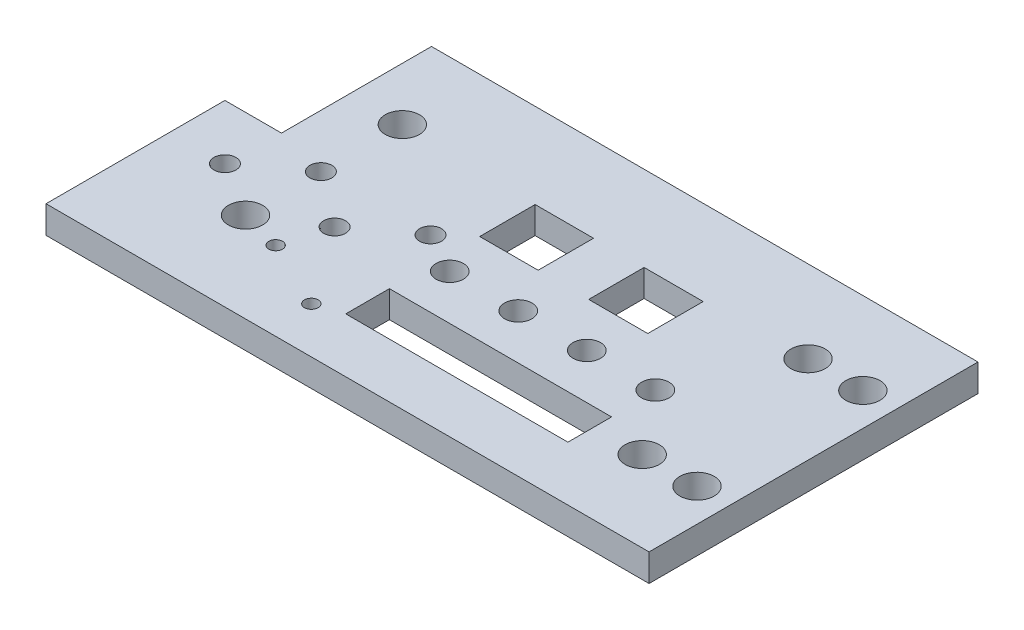
ISO-10303-21;
HEADER;
FILE_DESCRIPTION(('STEP AP214'),'2;1');
FILE_NAME('part.step','',(''),(''),'','','');
FILE_SCHEMA(('AUTOMOTIVE_DESIGN { 1 0 10303 214 1 1 1 1 }'));
ENDSEC;
DATA;
#1=APPLICATION_CONTEXT('core data for automotive mechanical design processes');
#2=APPLICATION_PROTOCOL_DEFINITION('international standard','automotive_design',2000,#1);
#3=PRODUCT_CONTEXT('',#1,'mechanical');
#4=PRODUCT('Part','Part','',(#3));
#5=PRODUCT_RELATED_PRODUCT_CATEGORY('part','',(#4));
#6=PRODUCT_DEFINITION_FORMATION('','',#4);
#7=PRODUCT_DEFINITION_CONTEXT('part definition',#1,'design');
#8=PRODUCT_DEFINITION('design','',#6,#7);
#9=PRODUCT_DEFINITION_SHAPE('','',#8);
#10=(LENGTH_UNIT() NAMED_UNIT(*) SI_UNIT(.MILLI.,.METRE.));
#11=(NAMED_UNIT(*) PLANE_ANGLE_UNIT() SI_UNIT($,.RADIAN.));
#12=(NAMED_UNIT(*) SI_UNIT($,.STERADIAN.) SOLID_ANGLE_UNIT());
#13=UNCERTAINTY_MEASURE_WITH_UNIT(LENGTH_MEASURE(1.E-05),#10,'distance_accuracy_value','');
#14=(GEOMETRIC_REPRESENTATION_CONTEXT(3) GLOBAL_UNCERTAINTY_ASSIGNED_CONTEXT((#13)) GLOBAL_UNIT_ASSIGNED_CONTEXT((#10,
#11,#12)) REPRESENTATION_CONTEXT('',''));
#15=CARTESIAN_POINT('',(0.,0.,0.));
#16=DIRECTION('',(0.,0.,1.));
#17=DIRECTION('',(1.,0.,0.));
#18=AXIS2_PLACEMENT_3D('',#15,#16,#17);
#19=CARTESIAN_POINT('',(110.,-10.,60.));
#20=DIRECTION('',(1.,0.,0.));
#21=DIRECTION('',(0.,0.,-1.));
#22=AXIS2_PLACEMENT_3D('',#19,#20,#21);
#23=PLANE('',#22);
#24=DIRECTION('',(0.,0.,-1.));
#25=VECTOR('',#24,1.);
#26=CARTESIAN_POINT('',(110.,0.,60.));
#27=LINE('',#26,#25);
#28=CARTESIAN_POINT('',(110.,0.,60.));
#29=VERTEX_POINT('',#28);
#30=CARTESIAN_POINT('',(110.,0.,-60.));
#31=VERTEX_POINT('',#30);
#32=EDGE_CURVE('E328',#29,#31,#27,.T.);
#33=ORIENTED_EDGE('',*,*,#32,.F.);
#34=DIRECTION('',(0.,1.,0.));
#35=VECTOR('',#34,1.);
#36=CARTESIAN_POINT('',(110.,-10.,60.));
#37=LINE('',#36,#35);
#38=CARTESIAN_POINT('',(110.,-10.,60.));
#39=VERTEX_POINT('',#38);
#40=EDGE_CURVE('E11',#39,#29,#37,.T.);
#41=ORIENTED_EDGE('',*,*,#40,.F.);
#42=DIRECTION('',(0.,0.,-1.));
#43=VECTOR('',#42,1.);
#44=CARTESIAN_POINT('',(110.,-10.,60.));
#45=LINE('',#44,#43);
#46=CARTESIAN_POINT('',(110.,-10.,-60.));
#47=VERTEX_POINT('',#46);
#48=EDGE_CURVE('E329',#39,#47,#45,.T.);
#49=ORIENTED_EDGE('',*,*,#48,.T.);
#50=DIRECTION('',(0.,1.,0.));
#51=VECTOR('',#50,1.);
#52=CARTESIAN_POINT('',(110.,-10.,-60.));
#53=LINE('',#52,#51);
#54=EDGE_CURVE('E341',#47,#31,#53,.T.);
#55=ORIENTED_EDGE('',*,*,#54,.T.);
#56=EDGE_LOOP('',(#33,#41,#49,#55));
#57=FACE_BOUND('',#56,.T.);
#58=ADVANCED_FACE('F41',(#57),#23,.T.);
#59=CARTESIAN_POINT('',(-110.,-10.,60.));
#60=DIRECTION('',(0.,0.,1.));
#61=DIRECTION('',(1.,0.,0.));
#62=AXIS2_PLACEMENT_3D('',#59,#60,#61);
#63=PLANE('',#62);
#64=DIRECTION('',(1.,0.,0.));
#65=VECTOR('',#64,1.);
#66=CARTESIAN_POINT('',(-110.,0.,60.));
#67=LINE('',#66,#65);
#68=CARTESIAN_POINT('',(-110.,0.,60.));
#69=VERTEX_POINT('',#68);
#70=EDGE_CURVE('E333',#69,#29,#67,.T.);
#71=ORIENTED_EDGE('',*,*,#70,.F.);
#72=DIRECTION('',(0.,1.,0.));
#73=VECTOR('',#72,1.);
#74=CARTESIAN_POINT('',(-110.,-10.,60.));
#75=LINE('',#74,#73);
#76=CARTESIAN_POINT('',(-110.,-10.,60.));
#77=VERTEX_POINT('',#76);
#78=EDGE_CURVE('E51',#77,#69,#75,.T.);
#79=ORIENTED_EDGE('',*,*,#78,.F.);
#80=DIRECTION('',(1.,0.,0.));
#81=VECTOR('',#80,1.);
#82=CARTESIAN_POINT('',(-110.,-10.,60.));
#83=LINE('',#82,#81);
#84=EDGE_CURVE('E338',#77,#39,#83,.T.);
#85=ORIENTED_EDGE('',*,*,#84,.T.);
#86=ORIENTED_EDGE('',*,*,#40,.T.);
#87=EDGE_LOOP('',(#71,#79,#85,#86));
#88=FACE_BOUND('',#87,.T.);
#89=ADVANCED_FACE('F423',(#88),#63,.T.);
#90=CARTESIAN_POINT('',(-110.,-10.,60.));
#91=DIRECTION('',(-1.,0.,0.));
#92=DIRECTION('',(0.,0.,1.));
#93=AXIS2_PLACEMENT_3D('',#90,#91,#92);
#94=PLANE('',#93);
#95=DIRECTION('',(0.,1.,0.));
#96=VECTOR('',#95,1.);
#97=CARTESIAN_POINT('',(-110.,-10.001,-5.2699959967968));
#98=LINE('',#97,#96);
#99=CARTESIAN_POINT('',(-110.,-10.,-5.2699959967968));
#100=VERTEX_POINT('',#99);
#101=CARTESIAN_POINT('',(-110.,0.,-5.2699959967968));
#102=VERTEX_POINT('',#101);
#103=EDGE_CURVE('E318',#100,#102,#98,.T.);
#104=ORIENTED_EDGE('',*,*,#103,.F.);
#105=DIRECTION('',(0.,0.,1.));
#106=VECTOR('',#105,1.);
#107=CARTESIAN_POINT('',(-110.,-10.,60.));
#108=LINE('',#107,#106);
#109=EDGE_CURVE('E336',#100,#77,#108,.T.);
#110=ORIENTED_EDGE('',*,*,#109,.T.);
#111=ORIENTED_EDGE('',*,*,#78,.T.);
#112=DIRECTION('',(0.,0.,1.));
#113=VECTOR('',#112,1.);
#114=CARTESIAN_POINT('',(-110.,0.,60.));
#115=LINE('',#114,#113);
#116=EDGE_CURVE('E347',#102,#69,#115,.T.);
#117=ORIENTED_EDGE('',*,*,#116,.F.);
#118=EDGE_LOOP('',(#104,#110,#111,#117));
#119=FACE_BOUND('',#118,.T.);
#120=ADVANCED_FACE('F429',(#119),#94,.T.);
#121=CARTESIAN_POINT('',(-110.,-10.,-60.));
#122=DIRECTION('',(0.,0.,-1.));
#123=DIRECTION('',(-1.,0.,0.));
#124=AXIS2_PLACEMENT_3D('',#121,#122,#123);
#125=PLANE('',#124);
#126=DIRECTION('',(0.,1.,0.));
#127=VECTOR('',#126,1.);
#128=CARTESIAN_POINT('',(-89.3674969975976,-10.001,-60.));
#129=LINE('',#128,#127);
#130=CARTESIAN_POINT('',(-89.3674969975976,-10.,-60.));
#131=VERTEX_POINT('',#130);
#132=CARTESIAN_POINT('',(-89.3674969975976,0.,-60.));
#133=VERTEX_POINT('',#132);
#134=EDGE_CURVE('E319',#131,#133,#129,.T.);
#135=ORIENTED_EDGE('',*,*,#134,.T.);
#136=DIRECTION('',(-1.,0.,0.));
#137=VECTOR('',#136,1.);
#138=CARTESIAN_POINT('',(-110.,0.,-60.));
#139=LINE('',#138,#137);
#140=EDGE_CURVE('E344',#31,#133,#139,.T.);
#141=ORIENTED_EDGE('',*,*,#140,.F.);
#142=ORIENTED_EDGE('',*,*,#54,.F.);
#143=DIRECTION('',(-1.,0.,0.));
#144=VECTOR('',#143,1.);
#145=CARTESIAN_POINT('',(-110.,-10.,-60.));
#146=LINE('',#145,#144);
#147=EDGE_CURVE('E332',#47,#131,#146,.T.);
#148=ORIENTED_EDGE('',*,*,#147,.T.);
#149=EDGE_LOOP('',(#135,#141,#142,#148));
#150=FACE_BOUND('',#149,.T.);
#151=ADVANCED_FACE('F435',(#150),#125,.T.);
#152=CARTESIAN_POINT('',(0.,-10.,0.));
#153=DIRECTION('',(0.,-1.,0.));
#154=DIRECTION('',(0.,0.,-1.));
#155=AXIS2_PLACEMENT_3D('',#152,#153,#154);
#156=PLANE('',#155);
#157=DIRECTION('',(1.,0.,0.));
#158=VECTOR('',#157,1.);
#159=CARTESIAN_POINT('',(0.,-10.,40.3023463893584));
#160=LINE('',#159,#158);
#161=CARTESIAN_POINT('',(60.7023463893584,-10.,40.3023463893584));
#162=VERTEX_POINT('',#161);
#163=CARTESIAN_POINT('',(-20.7023463893584,-10.,40.3023463893584));
#164=VERTEX_POINT('',#163);
#165=EDGE_CURVE('E60',#162,#164,#160,.F.);
#166=ORIENTED_EDGE('',*,*,#165,.F.);
#167=DIRECTION('',(0.,0.,-1.));
#168=VECTOR('',#167,1.);
#169=CARTESIAN_POINT('',(60.7023463893584,-10.,0.));
#170=LINE('',#169,#168);
#171=CARTESIAN_POINT('',(60.7023463893584,-10.,24.0176536106416));
#172=VERTEX_POINT('',#171);
#173=EDGE_CURVE('E358',#172,#162,#170,.F.);
#174=ORIENTED_EDGE('',*,*,#173,.F.);
#175=DIRECTION('',(-1.,0.,0.));
#176=VECTOR('',#175,1.);
#177=CARTESIAN_POINT('',(0.,-10.,24.0176536106416));
#178=LINE('',#177,#176);
#179=CARTESIAN_POINT('',(-20.7023463893584,-10.,24.0176536106416));
#180=VERTEX_POINT('',#179);
#181=EDGE_CURVE('E361',#180,#172,#178,.F.);
#182=ORIENTED_EDGE('',*,*,#181,.F.);
#183=DIRECTION('',(0.,0.,1.));
#184=VECTOR('',#183,1.);
#185=CARTESIAN_POINT('',(-20.7023463893584,-10.,0.));
#186=LINE('',#185,#184);
#187=EDGE_CURVE('E363',#164,#180,#186,.F.);
#188=ORIENTED_EDGE('',*,*,#187,.F.);
#189=EDGE_LOOP('',(#166,#174,#182,#188));
#190=FACE_BOUND('',#189,.T.);
#191=CARTESIAN_POINT('',(-30.,-10.,-0.280000000000004));
#192=DIRECTION('',(0.,-1.,0.));
#193=DIRECTION('',(0.,0.,-1.));
#194=AXIS2_PLACEMENT_3D('',#191,#192,#193);
#195=CIRCLE('',#194,4.17455064928218);
#196=CARTESIAN_POINT('',(-30.,-10.,-4.45455064928218));
#197=VERTEX_POINT('',#196);
#198=EDGE_CURVE('E371',#197,#197,#195,.T.);
#199=ORIENTED_EDGE('',*,*,#198,.F.);
#200=EDGE_LOOP('',(#199));
#201=FACE_BOUND('',#200,.T.);
#202=CARTESIAN_POINT('',(-50.,-10.,14.72));
#203=DIRECTION('',(0.,-1.,0.));
#204=DIRECTION('',(0.,0.,-1.));
#205=AXIS2_PLACEMENT_3D('',#202,#203,#204);
#206=CIRCLE('',#205,4.17455064928218);
#207=CARTESIAN_POINT('',(-50.,-10.,10.5454493507178));
#208=VERTEX_POINT('',#207);
#209=EDGE_CURVE('E236',#208,#208,#206,.T.);
#210=ORIENTED_EDGE('',*,*,#209,.F.);
#211=EDGE_LOOP('',(#210));
#212=FACE_BOUND('',#211,.T.);
#213=CARTESIAN_POINT('',(-70.,-10.,-0.280000000000006));
#214=DIRECTION('',(0.,-1.,0.));
#215=DIRECTION('',(0.,0.,-1.));
#216=AXIS2_PLACEMENT_3D('',#213,#214,#215);
#217=CIRCLE('',#216,4.17455064928218);
#218=CARTESIAN_POINT('',(-70.,-10.,-4.45455064928219));
#219=VERTEX_POINT('',#218);
#220=EDGE_CURVE('E232',#219,#219,#217,.T.);
#221=ORIENTED_EDGE('',*,*,#220,.F.);
#222=EDGE_LOOP('',(#221));
#223=FACE_BOUND('',#222,.T.);
#224=CARTESIAN_POINT('',(-90.,-10.,14.72));
#225=DIRECTION('',(0.,-1.,0.));
#226=DIRECTION('',(0.,0.,-1.));
#227=AXIS2_PLACEMENT_3D('',#224,#225,#226);
#228=CIRCLE('',#227,4.17455064928218);
#229=CARTESIAN_POINT('',(-90.,-10.,10.5454493507178));
#230=VERTEX_POINT('',#229);
#231=EDGE_CURVE('E222',#230,#230,#228,.T.);
#232=ORIENTED_EDGE('',*,*,#231,.F.);
#233=EDGE_LOOP('',(#232));
#234=FACE_BOUND('',#233,.T.);
#235=DIRECTION('',(-1.,0.,0.));
#236=VECTOR('',#235,1.);
#237=CARTESIAN_POINT('',(0.,-10.,-29.1423463893584));
#238=LINE('',#237,#236);
#239=CARTESIAN_POINT('',(19.0476536106416,-10.,-29.1423463893584));
#240=VERTEX_POINT('',#239);
#241=CARTESIAN_POINT('',(40.9523463893584,-10.,-29.1423463893584));
#242=VERTEX_POINT('',#241);
#243=EDGE_CURVE('E226',#240,#242,#238,.F.);
#244=ORIENTED_EDGE('',*,*,#243,.F.);
#245=DIRECTION('',(0.,0.,1.));
#246=VECTOR('',#245,1.);
#247=CARTESIAN_POINT('',(19.0476536106416,-10.,0.));
#248=LINE('',#247,#246);
#249=CARTESIAN_POINT('',(19.0476536106416,-10.,-8.57765361064159));
#250=VERTEX_POINT('',#249);
#251=EDGE_CURVE('E384',#250,#240,#248,.F.);
#252=ORIENTED_EDGE('',*,*,#251,.F.);
#253=DIRECTION('',(1.,0.,0.));
#254=VECTOR('',#253,1.);
#255=CARTESIAN_POINT('',(0.,-10.,-8.57765361064159));
#256=LINE('',#255,#254);
#257=CARTESIAN_POINT('',(40.9523463893584,-10.,-8.5776536106416));
#258=VERTEX_POINT('',#257);
#259=EDGE_CURVE('E386',#258,#250,#256,.F.);
#260=ORIENTED_EDGE('',*,*,#259,.F.);
#261=DIRECTION('',(0.,0.,-1.));
#262=VECTOR('',#261,1.);
#263=CARTESIAN_POINT('',(40.9523463893584,-10.,0.));
#264=LINE('',#263,#262);
#265=EDGE_CURVE('E389',#242,#258,#264,.F.);
#266=ORIENTED_EDGE('',*,*,#265,.F.);
#267=EDGE_LOOP('',(#244,#252,#260,#266));
#268=FACE_BOUND('',#267,.T.);
#269=DIRECTION('',(0.,0.,1.));
#270=VECTOR('',#269,1.);
#271=CARTESIAN_POINT('',(-20.7023463893584,-10.,0.));
#272=LINE('',#271,#270);
#273=CARTESIAN_POINT('',(-20.7023463893584,-10.,-8.57765361064159));
#274=VERTEX_POINT('',#273);
#275=CARTESIAN_POINT('',(-20.7023463893584,-10.,-29.1423463893584));
#276=VERTEX_POINT('',#275);
#277=EDGE_CURVE('E45',#274,#276,#272,.F.);
#278=ORIENTED_EDGE('',*,*,#277,.F.);
#279=DIRECTION('',(1.,0.,0.));
#280=VECTOR('',#279,1.);
#281=CARTESIAN_POINT('',(0.,-10.,-8.57765361064159));
#282=LINE('',#281,#280);
#283=CARTESIAN_POINT('',(0.952346389358437,-10.,-8.57765361064159));
#284=VERTEX_POINT('',#283);
#285=EDGE_CURVE('E397',#284,#274,#282,.F.);
#286=ORIENTED_EDGE('',*,*,#285,.F.);
#287=DIRECTION('',(0.,0.,-1.));
#288=VECTOR('',#287,1.);
#289=CARTESIAN_POINT('',(0.952346389358438,-10.,0.));
#290=LINE('',#289,#288);
#291=CARTESIAN_POINT('',(0.952346389358436,-10.,-29.1423463893584));
#292=VERTEX_POINT('',#291);
#293=EDGE_CURVE('E400',#292,#284,#290,.F.);
#294=ORIENTED_EDGE('',*,*,#293,.F.);
#295=DIRECTION('',(-1.,0.,0.));
#296=VECTOR('',#295,1.);
#297=CARTESIAN_POINT('',(0.,-10.,-29.1423463893584));
#298=LINE('',#297,#296);
#299=EDGE_CURVE('E198',#276,#292,#298,.F.);
#300=ORIENTED_EDGE('',*,*,#299,.F.);
#301=EDGE_LOOP('',(#278,#286,#294,#300));
#302=FACE_BOUND('',#301,.T.);
#303=CARTESIAN_POINT('',(-30.,-10.,43.22));
#304=DIRECTION('',(0.,-1.,0.));
#305=DIRECTION('',(0.,0.,-1.));
#306=AXIS2_PLACEMENT_3D('',#303,#304,#305);
#307=CIRCLE('',#306,2.5);
#308=CARTESIAN_POINT('',(-30.,-10.,40.72));
#309=VERTEX_POINT('',#308);
#310=EDGE_CURVE('E237',#309,#309,#307,.T.);
#311=ORIENTED_EDGE('',*,*,#310,.F.);
#312=EDGE_LOOP('',(#311));
#313=FACE_BOUND('',#312,.T.);
#314=CARTESIAN_POINT('',(-55.,-10.,31.22));
#315=DIRECTION('',(0.,-1.,0.));
#316=DIRECTION('',(0.,0.,-1.));
#317=AXIS2_PLACEMENT_3D('',#314,#315,#316);
#318=CIRCLE('',#317,2.5);
#319=CARTESIAN_POINT('',(-55.,-10.,28.72));
#320=VERTEX_POINT('',#319);
#321=EDGE_CURVE('E244',#320,#320,#318,.T.);
#322=ORIENTED_EDGE('',*,*,#321,.F.);
#323=EDGE_LOOP('',(#322));
#324=FACE_BOUND('',#323,.T.);
#325=CARTESIAN_POINT('',(60.,-10.,7.72));
#326=DIRECTION('',(0.,-1.,0.));
#327=DIRECTION('',(0.,0.,-1.));
#328=AXIS2_PLACEMENT_3D('',#325,#326,#327);
#329=CIRCLE('',#328,5.);
#330=CARTESIAN_POINT('',(60.,-10.,2.71999999999999));
#331=VERTEX_POINT('',#330);
#332=EDGE_CURVE('E250',#331,#331,#329,.T.);
#333=ORIENTED_EDGE('',*,*,#332,.F.);
#334=EDGE_LOOP('',(#333));
#335=FACE_BOUND('',#334,.T.);
#336=CARTESIAN_POINT('',(35.,-10.,7.72));
#337=DIRECTION('',(0.,-1.,0.));
#338=DIRECTION('',(0.,0.,-1.));
#339=AXIS2_PLACEMENT_3D('',#336,#337,#338);
#340=CIRCLE('',#339,5.);
#341=CARTESIAN_POINT('',(35.,-10.,2.72));
#342=VERTEX_POINT('',#341);
#343=EDGE_CURVE('E256',#342,#342,#340,.T.);
#344=ORIENTED_EDGE('',*,*,#343,.F.);
#345=EDGE_LOOP('',(#344));
#346=FACE_BOUND('',#345,.T.);
#347=CARTESIAN_POINT('',(9.99999999999999,-10.,7.72));
#348=DIRECTION('',(0.,-1.,0.));
#349=DIRECTION('',(0.,0.,-1.));
#350=AXIS2_PLACEMENT_3D('',#347,#348,#349);
#351=CIRCLE('',#350,5.);
#352=CARTESIAN_POINT('',(9.99999999999999,-10.,2.72));
#353=VERTEX_POINT('',#352);
#354=EDGE_CURVE('E262',#353,#353,#351,.T.);
#355=ORIENTED_EDGE('',*,*,#354,.F.);
#356=EDGE_LOOP('',(#355));
#357=FACE_BOUND('',#356,.T.);
#358=CARTESIAN_POINT('',(-15.,-10.,7.72));
#359=DIRECTION('',(0.,-1.,0.));
#360=DIRECTION('',(0.,0.,-1.));
#361=AXIS2_PLACEMENT_3D('',#358,#359,#360);
#362=CIRCLE('',#361,5.);
#363=CARTESIAN_POINT('',(-15.,-10.,2.72));
#364=VERTEX_POINT('',#363);
#365=EDGE_CURVE('E268',#364,#364,#362,.T.);
#366=ORIENTED_EDGE('',*,*,#365,.F.);
#367=EDGE_LOOP('',(#366));
#368=FACE_BOUND('',#367,.T.);
#369=CARTESIAN_POINT('',(98.,-10.,-30.));
#370=DIRECTION('',(0.,-1.,0.));
#371=DIRECTION('',(0.,0.,-1.));
#372=AXIS2_PLACEMENT_3D('',#369,#370,#371);
#373=CIRCLE('',#372,6.25000000000001);
#374=CARTESIAN_POINT('',(98.,-10.,-36.25));
#375=VERTEX_POINT('',#374);
#376=EDGE_CURVE('E274',#375,#375,#373,.T.);
#377=ORIENTED_EDGE('',*,*,#376,.F.);
#378=EDGE_LOOP('',(#377));
#379=FACE_BOUND('',#378,.T.);
#380=CARTESIAN_POINT('',(78.,-10.,-30.));
#381=DIRECTION('',(0.,-1.,0.));
#382=DIRECTION('',(0.,0.,-1.));
#383=AXIS2_PLACEMENT_3D('',#380,#381,#382);
#384=CIRCLE('',#383,6.24999999999999);
#385=CARTESIAN_POINT('',(78.,-10.,-36.25));
#386=VERTEX_POINT('',#385);
#387=EDGE_CURVE('E280',#386,#386,#384,.T.);
#388=ORIENTED_EDGE('',*,*,#387,.F.);
#389=EDGE_LOOP('',(#388));
#390=FACE_BOUND('',#389,.T.);
#391=CARTESIAN_POINT('',(-70.,-10.,-30.));
#392=DIRECTION('',(0.,-1.,0.));
#393=DIRECTION('',(0.,0.,-1.));
#394=AXIS2_PLACEMENT_3D('',#391,#392,#393);
#395=CIRCLE('',#394,6.25000000000001);
#396=CARTESIAN_POINT('',(-70.,-10.,-36.25));
#397=VERTEX_POINT('',#396);
#398=EDGE_CURVE('E286',#397,#397,#395,.T.);
#399=ORIENTED_EDGE('',*,*,#398,.F.);
#400=EDGE_LOOP('',(#399));
#401=FACE_BOUND('',#400,.T.);
#402=CARTESIAN_POINT('',(98.,-10.,30.5));
#403=DIRECTION('',(0.,-1.,0.));
#404=DIRECTION('',(0.,0.,-1.));
#405=AXIS2_PLACEMENT_3D('',#402,#403,#404);
#406=CIRCLE('',#405,6.25000000000001);
#407=CARTESIAN_POINT('',(98.,-10.,24.25));
#408=VERTEX_POINT('',#407);
#409=EDGE_CURVE('E292',#408,#408,#406,.T.);
#410=ORIENTED_EDGE('',*,*,#409,.F.);
#411=EDGE_LOOP('',(#410));
#412=FACE_BOUND('',#411,.T.);
#413=CARTESIAN_POINT('',(78.,-10.,30.5));
#414=DIRECTION('',(0.,-1.,0.));
#415=DIRECTION('',(0.,0.,-1.));
#416=AXIS2_PLACEMENT_3D('',#413,#414,#415);
#417=CIRCLE('',#416,6.25000000000001);
#418=CARTESIAN_POINT('',(78.,-10.,24.25));
#419=VERTEX_POINT('',#418);
#420=EDGE_CURVE('E298',#419,#419,#417,.T.);
#421=ORIENTED_EDGE('',*,*,#420,.F.);
#422=EDGE_LOOP('',(#421));
#423=FACE_BOUND('',#422,.T.);
#424=CARTESIAN_POINT('',(-70.,-10.,27.22));
#425=DIRECTION('',(0.,-1.,0.));
#426=DIRECTION('',(0.,0.,-1.));
#427=AXIS2_PLACEMENT_3D('',#424,#425,#426);
#428=CIRCLE('',#427,6.24999999999999);
#429=CARTESIAN_POINT('',(-70.,-10.,20.97));
#430=VERTEX_POINT('',#429);
#431=EDGE_CURVE('E304',#430,#430,#428,.T.);
#432=ORIENTED_EDGE('',*,*,#431,.F.);
#433=EDGE_LOOP('',(#432));
#434=FACE_BOUND('',#433,.T.);
#435=DIRECTION('',(0.,0.,-1.));
#436=VECTOR('',#435,1.);
#437=CARTESIAN_POINT('',(-89.3674969975976,-10.,-60.));
#438=LINE('',#437,#436);
#439=CARTESIAN_POINT('',(-89.3674969975976,-10.,-5.2699959967968));
#440=VERTEX_POINT('',#439);
#441=EDGE_CURVE('E310',#440,#131,#438,.T.);
#442=ORIENTED_EDGE('',*,*,#441,.T.);
#443=ORIENTED_EDGE('',*,*,#147,.F.);
#444=ORIENTED_EDGE('',*,*,#48,.F.);
#445=ORIENTED_EDGE('',*,*,#84,.F.);
#446=ORIENTED_EDGE('',*,*,#109,.F.);
#447=DIRECTION('',(1.,0.,0.));
#448=VECTOR('',#447,1.);
#449=CARTESIAN_POINT('',(-110.,-10.,-5.2699959967968));
#450=LINE('',#449,#448);
#451=EDGE_CURVE('E322',#100,#440,#450,.T.);
#452=ORIENTED_EDGE('',*,*,#451,.T.);
#453=EDGE_LOOP('',(#442,#443,#444,#445,#446,#452));
#454=FACE_BOUND('',#453,.T.);
#455=ADVANCED_FACE('F403',(#190,#201,#212,#223,#234,#268,#302,#313,#324,#335,#346,#357,#368,
#379,#390,#401,#412,#423,#434,#454),#156,.T.);
#456=CARTESIAN_POINT('',(0.,0.,0.));
#457=DIRECTION('',(0.,-1.,0.));
#458=DIRECTION('',(0.,0.,-1.));
#459=AXIS2_PLACEMENT_3D('',#456,#457,#458);
#460=PLANE('',#459);
#461=DIRECTION('',(0.,0.,-1.));
#462=VECTOR('',#461,1.);
#463=CARTESIAN_POINT('',(60.5277957400762,0.,40.1277957400762));
#464=LINE('',#463,#462);
#465=CARTESIAN_POINT('',(60.5277957400762,0.,40.1277957400762));
#466=VERTEX_POINT('',#465);
#467=CARTESIAN_POINT('',(60.5277957400762,0.,24.1922042599238));
#468=VERTEX_POINT('',#467);
#469=EDGE_CURVE('E855',#466,#468,#464,.T.);
#470=ORIENTED_EDGE('',*,*,#469,.F.);
#471=DIRECTION('',(1.,0.,0.));
#472=VECTOR('',#471,1.);
#473=CARTESIAN_POINT('',(-20.5277957400762,0.,40.1277957400762));
#474=LINE('',#473,#472);
#475=CARTESIAN_POINT('',(-20.5277957400762,0.,40.1277957400762));
#476=VERTEX_POINT('',#475);
#477=EDGE_CURVE('E366',#476,#466,#474,.T.);
#478=ORIENTED_EDGE('',*,*,#477,.F.);
#479=DIRECTION('',(0.,0.,1.));
#480=VECTOR('',#479,1.);
#481=CARTESIAN_POINT('',(-20.5277957400762,0.,24.1922042599238));
#482=LINE('',#481,#480);
#483=CARTESIAN_POINT('',(-20.5277957400762,0.,24.1922042599238));
#484=VERTEX_POINT('',#483);
#485=EDGE_CURVE('E241',#484,#476,#482,.T.);
#486=ORIENTED_EDGE('',*,*,#485,.F.);
#487=DIRECTION('',(-1.,0.,0.));
#488=VECTOR('',#487,1.);
#489=CARTESIAN_POINT('',(60.5277957400762,0.,24.1922042599238));
#490=LINE('',#489,#488);
#491=EDGE_CURVE('E104',#468,#484,#490,.T.);
#492=ORIENTED_EDGE('',*,*,#491,.F.);
#493=EDGE_LOOP('',(#470,#478,#486,#492));
#494=FACE_BOUND('',#493,.T.);
#495=CARTESIAN_POINT('',(-30.,0.,-0.280000000000004));
#496=DIRECTION('',(0.,-1.,0.));
#497=DIRECTION('',(0.,0.,-1.));
#498=AXIS2_PLACEMENT_3D('',#495,#496,#497);
#499=CIRCLE('',#498,4.);
#500=CARTESIAN_POINT('',(-30.,0.,-4.28));
#501=VERTEX_POINT('',#500);
#502=EDGE_CURVE('E214',#501,#501,#499,.F.);
#503=ORIENTED_EDGE('',*,*,#502,.F.);
#504=EDGE_LOOP('',(#503));
#505=FACE_BOUND('',#504,.T.);
#506=CARTESIAN_POINT('',(-50.,0.,14.72));
#507=DIRECTION('',(0.,-1.,0.));
#508=DIRECTION('',(0.,0.,-1.));
#509=AXIS2_PLACEMENT_3D('',#506,#507,#508);
#510=CIRCLE('',#509,4.00000000000001);
#511=CARTESIAN_POINT('',(-50.,0.,10.72));
#512=VERTEX_POINT('',#511);
#513=EDGE_CURVE('E374',#512,#512,#510,.F.);
#514=ORIENTED_EDGE('',*,*,#513,.F.);
#515=EDGE_LOOP('',(#514));
#516=FACE_BOUND('',#515,.T.);
#517=CARTESIAN_POINT('',(-70.,0.,-0.280000000000006));
#518=DIRECTION('',(0.,-1.,0.));
#519=DIRECTION('',(0.,0.,-1.));
#520=AXIS2_PLACEMENT_3D('',#517,#518,#519);
#521=CIRCLE('',#520,4.00000000000001);
#522=CARTESIAN_POINT('',(-70.,0.,-4.28000000000001));
#523=VERTEX_POINT('',#522);
#524=EDGE_CURVE('E233',#523,#523,#521,.F.);
#525=ORIENTED_EDGE('',*,*,#524,.F.);
#526=EDGE_LOOP('',(#525));
#527=FACE_BOUND('',#526,.T.);
#528=CARTESIAN_POINT('',(-90.,0.,14.72));
#529=DIRECTION('',(0.,-1.,0.));
#530=DIRECTION('',(0.,0.,-1.));
#531=AXIS2_PLACEMENT_3D('',#528,#529,#530);
#532=CIRCLE('',#531,4.00000000000001);
#533=CARTESIAN_POINT('',(-90.,0.,10.72));
#534=VERTEX_POINT('',#533);
#535=EDGE_CURVE('E229',#534,#534,#532,.F.);
#536=ORIENTED_EDGE('',*,*,#535,.F.);
#537=EDGE_LOOP('',(#536));
#538=FACE_BOUND('',#537,.T.);
#539=DIRECTION('',(0.,0.,1.));
#540=VECTOR('',#539,1.);
#541=CARTESIAN_POINT('',(19.2222042599238,0.,-28.9677957400762));
#542=LINE('',#541,#540);
#543=CARTESIAN_POINT('',(19.2222042599238,0.,-28.9677957400762));
#544=VERTEX_POINT('',#543);
#545=CARTESIAN_POINT('',(19.2222042599238,0.,-8.75220425992377));
#546=VERTEX_POINT('',#545);
#547=EDGE_CURVE('E210',#544,#546,#542,.T.);
#548=ORIENTED_EDGE('',*,*,#547,.F.);
#549=DIRECTION('',(-1.,0.,0.));
#550=VECTOR('',#549,1.);
#551=CARTESIAN_POINT('',(40.7777957400762,0.,-28.9677957400762));
#552=LINE('',#551,#550);
#553=CARTESIAN_POINT('',(40.7777957400762,0.,-28.9677957400762));
#554=VERTEX_POINT('',#553);
#555=EDGE_CURVE('E223',#554,#544,#552,.T.);
#556=ORIENTED_EDGE('',*,*,#555,.F.);
#557=DIRECTION('',(0.,0.,-1.));
#558=VECTOR('',#557,1.);
#559=CARTESIAN_POINT('',(40.7777957400762,0.,-8.75220425992377));
#560=LINE('',#559,#558);
#561=CARTESIAN_POINT('',(40.7777957400762,0.,-8.75220425992377));
#562=VERTEX_POINT('',#561);
#563=EDGE_CURVE('E218',#562,#554,#560,.T.);
#564=ORIENTED_EDGE('',*,*,#563,.F.);
#565=DIRECTION('',(1.,0.,0.));
#566=VECTOR('',#565,1.);
#567=CARTESIAN_POINT('',(19.2222042599238,0.,-8.75220425992377));
#568=LINE('',#567,#566);
#569=EDGE_CURVE('E207',#546,#562,#568,.T.);
#570=ORIENTED_EDGE('',*,*,#569,.F.);
#571=EDGE_LOOP('',(#548,#556,#564,#570));
#572=FACE_BOUND('',#571,.T.);
#573=DIRECTION('',(1.,0.,0.));
#574=VECTOR('',#573,1.);
#575=CARTESIAN_POINT('',(-20.5277957400762,0.,-8.75220425992377));
#576=LINE('',#575,#574);
#577=CARTESIAN_POINT('',(-20.5277957400762,0.,-8.75220425992377));
#578=VERTEX_POINT('',#577);
#579=CARTESIAN_POINT('',(0.777795740076261,0.,-8.75220425992377));
#580=VERTEX_POINT('',#579);
#581=EDGE_CURVE('E190',#578,#580,#576,.T.);
#582=ORIENTED_EDGE('',*,*,#581,.F.);
#583=DIRECTION('',(0.,0.,1.));
#584=VECTOR('',#583,1.);
#585=CARTESIAN_POINT('',(-20.5277957400762,0.,-28.9677957400762));
#586=LINE('',#585,#584);
#587=CARTESIAN_POINT('',(-20.5277957400762,0.,-28.9677957400762));
#588=VERTEX_POINT('',#587);
#589=EDGE_CURVE('E205',#588,#578,#586,.T.);
#590=ORIENTED_EDGE('',*,*,#589,.F.);
#591=DIRECTION('',(-1.,0.,0.));
#592=VECTOR('',#591,1.);
#593=CARTESIAN_POINT('',(0.777795740076259,0.,-28.9677957400762));
#594=LINE('',#593,#592);
#595=CARTESIAN_POINT('',(0.777795740076259,0.,-28.9677957400762));
#596=VERTEX_POINT('',#595);
#597=EDGE_CURVE('E195',#596,#588,#594,.T.);
#598=ORIENTED_EDGE('',*,*,#597,.F.);
#599=DIRECTION('',(0.,0.,-1.));
#600=VECTOR('',#599,1.);
#601=CARTESIAN_POINT('',(0.777795740076261,0.,-8.75220425992377));
#602=LINE('',#601,#600);
#603=EDGE_CURVE('E179',#580,#596,#602,.T.);
#604=ORIENTED_EDGE('',*,*,#603,.F.);
#605=EDGE_LOOP('',(#582,#590,#598,#604));
#606=FACE_BOUND('',#605,.T.);
#607=CARTESIAN_POINT('',(-30.,0.,43.22));
#608=DIRECTION('',(0.,-1.,0.));
#609=DIRECTION('',(0.,0.,-1.));
#610=AXIS2_PLACEMENT_3D('',#607,#608,#609);
#611=CIRCLE('',#610,2.5);
#612=CARTESIAN_POINT('',(-30.,0.,40.72));
#613=VERTEX_POINT('',#612);
#614=EDGE_CURVE('E240',#613,#613,#611,.T.);
#615=ORIENTED_EDGE('',*,*,#614,.T.);
#616=EDGE_LOOP('',(#615));
#617=FACE_BOUND('',#616,.T.);
#618=CARTESIAN_POINT('',(-55.,0.,31.22));
#619=DIRECTION('',(0.,-1.,0.));
#620=DIRECTION('',(0.,0.,-1.));
#621=AXIS2_PLACEMENT_3D('',#618,#619,#620);
#622=CIRCLE('',#621,2.5);
#623=CARTESIAN_POINT('',(-55.,0.,28.72));
#624=VERTEX_POINT('',#623);
#625=EDGE_CURVE('E247',#624,#624,#622,.T.);
#626=ORIENTED_EDGE('',*,*,#625,.T.);
#627=EDGE_LOOP('',(#626));
#628=FACE_BOUND('',#627,.T.);
#629=CARTESIAN_POINT('',(60.,0.,7.72));
#630=DIRECTION('',(0.,-1.,0.));
#631=DIRECTION('',(0.,0.,-1.));
#632=AXIS2_PLACEMENT_3D('',#629,#630,#631);
#633=CIRCLE('',#632,5.);
#634=CARTESIAN_POINT('',(60.,0.,2.71999999999999));
#635=VERTEX_POINT('',#634);
#636=EDGE_CURVE('E253',#635,#635,#633,.T.);
#637=ORIENTED_EDGE('',*,*,#636,.T.);
#638=EDGE_LOOP('',(#637));
#639=FACE_BOUND('',#638,.T.);
#640=CARTESIAN_POINT('',(35.,0.,7.72));
#641=DIRECTION('',(0.,-1.,0.));
#642=DIRECTION('',(0.,0.,-1.));
#643=AXIS2_PLACEMENT_3D('',#640,#641,#642);
#644=CIRCLE('',#643,5.);
#645=CARTESIAN_POINT('',(35.,0.,2.72));
#646=VERTEX_POINT('',#645);
#647=EDGE_CURVE('E259',#646,#646,#644,.T.);
#648=ORIENTED_EDGE('',*,*,#647,.T.);
#649=EDGE_LOOP('',(#648));
#650=FACE_BOUND('',#649,.T.);
#651=CARTESIAN_POINT('',(9.99999999999999,0.,7.72));
#652=DIRECTION('',(0.,-1.,0.));
#653=DIRECTION('',(0.,0.,-1.));
#654=AXIS2_PLACEMENT_3D('',#651,#652,#653);
#655=CIRCLE('',#654,5.);
#656=CARTESIAN_POINT('',(9.99999999999999,0.,2.72));
#657=VERTEX_POINT('',#656);
#658=EDGE_CURVE('E265',#657,#657,#655,.T.);
#659=ORIENTED_EDGE('',*,*,#658,.T.);
#660=EDGE_LOOP('',(#659));
#661=FACE_BOUND('',#660,.T.);
#662=CARTESIAN_POINT('',(-15.,0.,7.72));
#663=DIRECTION('',(0.,-1.,0.));
#664=DIRECTION('',(0.,0.,-1.));
#665=AXIS2_PLACEMENT_3D('',#662,#663,#664);
#666=CIRCLE('',#665,5.);
#667=CARTESIAN_POINT('',(-15.,0.,2.72));
#668=VERTEX_POINT('',#667);
#669=EDGE_CURVE('E271',#668,#668,#666,.T.);
#670=ORIENTED_EDGE('',*,*,#669,.T.);
#671=EDGE_LOOP('',(#670));
#672=FACE_BOUND('',#671,.T.);
#673=CARTESIAN_POINT('',(98.,0.,-30.));
#674=DIRECTION('',(0.,-1.,0.));
#675=DIRECTION('',(0.,0.,-1.));
#676=AXIS2_PLACEMENT_3D('',#673,#674,#675);
#677=CIRCLE('',#676,6.24999999999999);
#678=CARTESIAN_POINT('',(98.,0.,-36.25));
#679=VERTEX_POINT('',#678);
#680=EDGE_CURVE('E277',#679,#679,#677,.T.);
#681=ORIENTED_EDGE('',*,*,#680,.T.);
#682=EDGE_LOOP('',(#681));
#683=FACE_BOUND('',#682,.T.);
#684=CARTESIAN_POINT('',(78.,0.,-30.));
#685=DIRECTION('',(0.,-1.,0.));
#686=DIRECTION('',(0.,0.,-1.));
#687=AXIS2_PLACEMENT_3D('',#684,#685,#686);
#688=CIRCLE('',#687,6.24999999999999);
#689=CARTESIAN_POINT('',(78.,0.,-36.25));
#690=VERTEX_POINT('',#689);
#691=EDGE_CURVE('E283',#690,#690,#688,.T.);
#692=ORIENTED_EDGE('',*,*,#691,.T.);
#693=EDGE_LOOP('',(#692));
#694=FACE_BOUND('',#693,.T.);
#695=CARTESIAN_POINT('',(-70.,0.,-30.));
#696=DIRECTION('',(0.,-1.,0.));
#697=DIRECTION('',(0.,0.,-1.));
#698=AXIS2_PLACEMENT_3D('',#695,#696,#697);
#699=CIRCLE('',#698,6.24999999999999);
#700=CARTESIAN_POINT('',(-70.,0.,-36.25));
#701=VERTEX_POINT('',#700);
#702=EDGE_CURVE('E289',#701,#701,#699,.T.);
#703=ORIENTED_EDGE('',*,*,#702,.T.);
#704=EDGE_LOOP('',(#703));
#705=FACE_BOUND('',#704,.T.);
#706=CARTESIAN_POINT('',(98.,0.,30.5));
#707=DIRECTION('',(0.,-1.,0.));
#708=DIRECTION('',(0.,0.,-1.));
#709=AXIS2_PLACEMENT_3D('',#706,#707,#708);
#710=CIRCLE('',#709,6.24999999999999);
#711=CARTESIAN_POINT('',(98.,0.,24.25));
#712=VERTEX_POINT('',#711);
#713=EDGE_CURVE('E295',#712,#712,#710,.T.);
#714=ORIENTED_EDGE('',*,*,#713,.T.);
#715=EDGE_LOOP('',(#714));
#716=FACE_BOUND('',#715,.T.);
#717=CARTESIAN_POINT('',(78.,0.,30.5));
#718=DIRECTION('',(0.,-1.,0.));
#719=DIRECTION('',(0.,0.,-1.));
#720=AXIS2_PLACEMENT_3D('',#717,#718,#719);
#721=CIRCLE('',#720,6.24999999999999);
#722=CARTESIAN_POINT('',(78.,0.,24.25));
#723=VERTEX_POINT('',#722);
#724=EDGE_CURVE('E301',#723,#723,#721,.T.);
#725=ORIENTED_EDGE('',*,*,#724,.T.);
#726=EDGE_LOOP('',(#725));
#727=FACE_BOUND('',#726,.T.);
#728=CARTESIAN_POINT('',(-70.,0.,27.22));
#729=DIRECTION('',(0.,-1.,0.));
#730=DIRECTION('',(0.,0.,-1.));
#731=AXIS2_PLACEMENT_3D('',#728,#729,#730);
#732=CIRCLE('',#731,6.24999999999999);
#733=CARTESIAN_POINT('',(-70.,0.,20.97));
#734=VERTEX_POINT('',#733);
#735=EDGE_CURVE('E307',#734,#734,#732,.T.);
#736=ORIENTED_EDGE('',*,*,#735,.T.);
#737=EDGE_LOOP('',(#736));
#738=FACE_BOUND('',#737,.T.);
#739=ORIENTED_EDGE('',*,*,#140,.T.);
#740=DIRECTION('',(0.,0.,-1.));
#741=VECTOR('',#740,1.);
#742=CARTESIAN_POINT('',(-89.3674969975976,0.,-60.));
#743=LINE('',#742,#741);
#744=CARTESIAN_POINT('',(-89.3674969975976,0.,-5.2699959967968));
#745=VERTEX_POINT('',#744);
#746=EDGE_CURVE('E316',#745,#133,#743,.T.);
#747=ORIENTED_EDGE('',*,*,#746,.F.);
#748=DIRECTION('',(1.,0.,0.));
#749=VECTOR('',#748,1.);
#750=CARTESIAN_POINT('',(-110.,0.,-5.2699959967968));
#751=LINE('',#750,#749);
#752=EDGE_CURVE('E313',#102,#745,#751,.T.);
#753=ORIENTED_EDGE('',*,*,#752,.F.);
#754=ORIENTED_EDGE('',*,*,#116,.T.);
#755=ORIENTED_EDGE('',*,*,#70,.T.);
#756=ORIENTED_EDGE('',*,*,#32,.T.);
#757=EDGE_LOOP('',(#739,#747,#753,#754,#755,#756));
#758=FACE_BOUND('',#757,.T.);
#759=ADVANCED_FACE('F202',(#494,#505,#516,#527,#538,#572,#606,#617,#628,#639,#650,#661,#672,
#683,#694,#705,#716,#727,#738,#758),#460,.F.);
#760=CARTESIAN_POINT('',(-89.3674969975976,-10.001,-60.));
#761=DIRECTION('',(1.,0.,0.));
#762=DIRECTION('',(0.,0.,-1.));
#763=AXIS2_PLACEMENT_3D('',#760,#761,#762);
#764=PLANE('',#763);
#765=DIRECTION('',(0.,1.,0.));
#766=VECTOR('',#765,1.);
#767=CARTESIAN_POINT('',(-89.3674969975976,-10.001,-5.2699959967968));
#768=LINE('',#767,#766);
#769=EDGE_CURVE('E323',#440,#745,#768,.T.);
#770=ORIENTED_EDGE('',*,*,#769,.T.);
#771=ORIENTED_EDGE('',*,*,#746,.T.);
#772=ORIENTED_EDGE('',*,*,#134,.F.);
#773=ORIENTED_EDGE('',*,*,#441,.F.);
#774=EDGE_LOOP('',(#770,#771,#772,#773));
#775=FACE_BOUND('',#774,.T.);
#776=ADVANCED_FACE('F490',(#775),#764,.F.);
#777=CARTESIAN_POINT('',(-110.,-10.001,-5.2699959967968));
#778=DIRECTION('',(0.,0.,1.));
#779=DIRECTION('',(1.,0.,0.));
#780=AXIS2_PLACEMENT_3D('',#777,#778,#779);
#781=PLANE('',#780);
#782=ORIENTED_EDGE('',*,*,#103,.T.);
#783=ORIENTED_EDGE('',*,*,#752,.T.);
#784=ORIENTED_EDGE('',*,*,#769,.F.);
#785=ORIENTED_EDGE('',*,*,#451,.F.);
#786=EDGE_LOOP('',(#782,#783,#784,#785));
#787=FACE_BOUND('',#786,.T.);
#788=ADVANCED_FACE('F514',(#787),#781,.F.);
#789=CARTESIAN_POINT('',(-70.,-10.,27.22));
#790=DIRECTION('',(0.,-1.,0.));
#791=DIRECTION('',(0.,0.,-1.));
#792=AXIS2_PLACEMENT_3D('',#789,#790,#791);
#793=CYLINDRICAL_SURFACE('',#792,6.24999999999999);
#794=ORIENTED_EDGE('',*,*,#735,.F.);
#795=EDGE_LOOP('',(#794));
#796=FACE_BOUND('',#795,.T.);
#797=ORIENTED_EDGE('',*,*,#431,.T.);
#798=EDGE_LOOP('',(#797));
#799=FACE_BOUND('',#798,.T.);
#800=ADVANCED_FACE('F540',(#796,#799),#793,.F.);
#801=CARTESIAN_POINT('',(78.,-10.,30.5));
#802=DIRECTION('',(0.,-1.,0.));
#803=DIRECTION('',(0.,0.,-1.));
#804=AXIS2_PLACEMENT_3D('',#801,#802,#803);
#805=CYLINDRICAL_SURFACE('',#804,6.25);
#806=ORIENTED_EDGE('',*,*,#724,.F.);
#807=EDGE_LOOP('',(#806));
#808=FACE_BOUND('',#807,.T.);
#809=ORIENTED_EDGE('',*,*,#420,.T.);
#810=EDGE_LOOP('',(#809));
#811=FACE_BOUND('',#810,.T.);
#812=ADVANCED_FACE('F544',(#808,#811),#805,.F.);
#813=CARTESIAN_POINT('',(98.,-10.,30.5));
#814=DIRECTION('',(0.,-1.,0.));
#815=DIRECTION('',(0.,0.,-1.));
#816=AXIS2_PLACEMENT_3D('',#813,#814,#815);
#817=CYLINDRICAL_SURFACE('',#816,6.25);
#818=ORIENTED_EDGE('',*,*,#713,.F.);
#819=EDGE_LOOP('',(#818));
#820=FACE_BOUND('',#819,.T.);
#821=ORIENTED_EDGE('',*,*,#409,.T.);
#822=EDGE_LOOP('',(#821));
#823=FACE_BOUND('',#822,.T.);
#824=ADVANCED_FACE('F548',(#820,#823),#817,.F.);
#825=CARTESIAN_POINT('',(-70.,-10.,-30.));
#826=DIRECTION('',(0.,-1.,0.));
#827=DIRECTION('',(0.,0.,-1.));
#828=AXIS2_PLACEMENT_3D('',#825,#826,#827);
#829=CYLINDRICAL_SURFACE('',#828,6.25);
#830=ORIENTED_EDGE('',*,*,#702,.F.);
#831=EDGE_LOOP('',(#830));
#832=FACE_BOUND('',#831,.T.);
#833=ORIENTED_EDGE('',*,*,#398,.T.);
#834=EDGE_LOOP('',(#833));
#835=FACE_BOUND('',#834,.T.);
#836=ADVANCED_FACE('F552',(#832,#835),#829,.F.);
#837=CARTESIAN_POINT('',(78.,-10.,-30.));
#838=DIRECTION('',(0.,-1.,0.));
#839=DIRECTION('',(0.,0.,-1.));
#840=AXIS2_PLACEMENT_3D('',#837,#838,#839);
#841=CYLINDRICAL_SURFACE('',#840,6.24999999999999);
#842=ORIENTED_EDGE('',*,*,#691,.F.);
#843=EDGE_LOOP('',(#842));
#844=FACE_BOUND('',#843,.T.);
#845=ORIENTED_EDGE('',*,*,#387,.T.);
#846=EDGE_LOOP('',(#845));
#847=FACE_BOUND('',#846,.T.);
#848=ADVANCED_FACE('F556',(#844,#847),#841,.F.);
#849=CARTESIAN_POINT('',(98.,-10.,-30.));
#850=DIRECTION('',(0.,-1.,0.));
#851=DIRECTION('',(0.,0.,-1.));
#852=AXIS2_PLACEMENT_3D('',#849,#850,#851);
#853=CYLINDRICAL_SURFACE('',#852,6.25);
#854=ORIENTED_EDGE('',*,*,#680,.F.);
#855=EDGE_LOOP('',(#854));
#856=FACE_BOUND('',#855,.T.);
#857=ORIENTED_EDGE('',*,*,#376,.T.);
#858=EDGE_LOOP('',(#857));
#859=FACE_BOUND('',#858,.T.);
#860=ADVANCED_FACE('F560',(#856,#859),#853,.F.);
#861=CARTESIAN_POINT('',(-15.,-10.,7.72));
#862=DIRECTION('',(0.,-1.,0.));
#863=DIRECTION('',(0.,0.,-1.));
#864=AXIS2_PLACEMENT_3D('',#861,#862,#863);
#865=CYLINDRICAL_SURFACE('',#864,5.);
#866=ORIENTED_EDGE('',*,*,#669,.F.);
#867=EDGE_LOOP('',(#866));
#868=FACE_BOUND('',#867,.T.);
#869=ORIENTED_EDGE('',*,*,#365,.T.);
#870=EDGE_LOOP('',(#869));
#871=FACE_BOUND('',#870,.T.);
#872=ADVANCED_FACE('F564',(#868,#871),#865,.F.);
#873=CARTESIAN_POINT('',(9.99999999999999,-10.,7.72));
#874=DIRECTION('',(0.,-1.,0.));
#875=DIRECTION('',(0.,0.,-1.));
#876=AXIS2_PLACEMENT_3D('',#873,#874,#875);
#877=CYLINDRICAL_SURFACE('',#876,5.);
#878=ORIENTED_EDGE('',*,*,#658,.F.);
#879=EDGE_LOOP('',(#878));
#880=FACE_BOUND('',#879,.T.);
#881=ORIENTED_EDGE('',*,*,#354,.T.);
#882=EDGE_LOOP('',(#881));
#883=FACE_BOUND('',#882,.T.);
#884=ADVANCED_FACE('F568',(#880,#883),#877,.F.);
#885=CARTESIAN_POINT('',(35.,-10.,7.72));
#886=DIRECTION('',(0.,-1.,0.));
#887=DIRECTION('',(0.,0.,-1.));
#888=AXIS2_PLACEMENT_3D('',#885,#886,#887);
#889=CYLINDRICAL_SURFACE('',#888,5.);
#890=ORIENTED_EDGE('',*,*,#647,.F.);
#891=EDGE_LOOP('',(#890));
#892=FACE_BOUND('',#891,.T.);
#893=ORIENTED_EDGE('',*,*,#343,.T.);
#894=EDGE_LOOP('',(#893));
#895=FACE_BOUND('',#894,.T.);
#896=ADVANCED_FACE('F572',(#892,#895),#889,.F.);
#897=CARTESIAN_POINT('',(60.,-10.,7.72));
#898=DIRECTION('',(0.,-1.,0.));
#899=DIRECTION('',(0.,0.,-1.));
#900=AXIS2_PLACEMENT_3D('',#897,#898,#899);
#901=CYLINDRICAL_SURFACE('',#900,5.);
#902=ORIENTED_EDGE('',*,*,#636,.F.);
#903=EDGE_LOOP('',(#902));
#904=FACE_BOUND('',#903,.T.);
#905=ORIENTED_EDGE('',*,*,#332,.T.);
#906=EDGE_LOOP('',(#905));
#907=FACE_BOUND('',#906,.T.);
#908=ADVANCED_FACE('F576',(#904,#907),#901,.F.);
#909=CARTESIAN_POINT('',(-55.,-10.,31.22));
#910=DIRECTION('',(0.,-1.,0.));
#911=DIRECTION('',(0.,0.,-1.));
#912=AXIS2_PLACEMENT_3D('',#909,#910,#911);
#913=CYLINDRICAL_SURFACE('',#912,2.5);
#914=ORIENTED_EDGE('',*,*,#625,.F.);
#915=EDGE_LOOP('',(#914));
#916=FACE_BOUND('',#915,.T.);
#917=ORIENTED_EDGE('',*,*,#321,.T.);
#918=EDGE_LOOP('',(#917));
#919=FACE_BOUND('',#918,.T.);
#920=ADVANCED_FACE('F417',(#916,#919),#913,.F.);
#921=CARTESIAN_POINT('',(-30.,-10.,43.22));
#922=DIRECTION('',(0.,-1.,0.));
#923=DIRECTION('',(0.,0.,-1.));
#924=AXIS2_PLACEMENT_3D('',#921,#922,#923);
#925=CYLINDRICAL_SURFACE('',#924,2.5);
#926=ORIENTED_EDGE('',*,*,#614,.F.);
#927=EDGE_LOOP('',(#926));
#928=FACE_BOUND('',#927,.T.);
#929=ORIENTED_EDGE('',*,*,#310,.T.);
#930=EDGE_LOOP('',(#929));
#931=FACE_BOUND('',#930,.T.);
#932=ADVANCED_FACE('F409',(#928,#931),#925,.F.);
#933=CARTESIAN_POINT('',(-20.5277957400762,0.,-28.9677957400762));
#934=DIRECTION('',(0.999847695156391,-0.0174524064372835,0.));
#935=DIRECTION('',(0.0174524064372835,0.999847695156391,0.));
#936=AXIS2_PLACEMENT_3D('',#933,#934,#935);
#937=PLANE('',#936);
#938=ORIENTED_EDGE('',*,*,#589,.T.);
#939=DIRECTION('',(-0.0174497491606827,-0.999695459881887,0.0174497491606827));
#940=VECTOR('',#939,1.);
#941=CARTESIAN_POINT('',(-20.5277957400762,0.,-8.75220425992377));
#942=LINE('',#941,#940);
#943=EDGE_CURVE('E206',#578,#274,#942,.T.);
#944=ORIENTED_EDGE('',*,*,#943,.T.);
#945=ORIENTED_EDGE('',*,*,#277,.T.);
#946=DIRECTION('',(-0.0174497491606827,-0.999695459881887,-0.0174497491606827));
#947=VECTOR('',#946,1.);
#948=CARTESIAN_POINT('',(-20.5277957400762,0.,-28.9677957400762));
#949=LINE('',#948,#947);
#950=EDGE_CURVE('E200',#588,#276,#949,.T.);
#951=ORIENTED_EDGE('',*,*,#950,.F.);
#952=EDGE_LOOP('',(#938,#944,#945,#951));
#953=FACE_BOUND('',#952,.T.);
#954=ADVANCED_FACE('F407',(#953),#937,.T.);
#955=CARTESIAN_POINT('',(-20.5277957400762,0.,-8.75220425992377));
#956=DIRECTION('',(0.,-0.0174524064372835,-0.999847695156391));
#957=DIRECTION('',(0.,0.999847695156391,-0.0174524064372835));
#958=AXIS2_PLACEMENT_3D('',#955,#956,#957);
#959=PLANE('',#958);
#960=ORIENTED_EDGE('',*,*,#581,.T.);
#961=DIRECTION('',(0.0174497491606827,-0.999695459881887,0.0174497491606827));
#962=VECTOR('',#961,1.);
#963=CARTESIAN_POINT('',(0.777795740076261,0.,-8.75220425992377));
#964=LINE('',#963,#962);
#965=EDGE_CURVE('E185',#580,#284,#964,.T.);
#966=ORIENTED_EDGE('',*,*,#965,.T.);
#967=ORIENTED_EDGE('',*,*,#285,.T.);
#968=ORIENTED_EDGE('',*,*,#943,.F.);
#969=EDGE_LOOP('',(#960,#966,#967,#968));
#970=FACE_BOUND('',#969,.T.);
#971=ADVANCED_FACE('F406',(#970),#959,.T.);
#972=CARTESIAN_POINT('',(0.777795740076261,0.,-8.75220425992377));
#973=DIRECTION('',(-0.999847695156391,-0.0174524064372835,0.));
#974=DIRECTION('',(0.0174524064372835,-0.999847695156391,0.));
#975=AXIS2_PLACEMENT_3D('',#972,#973,#974);
#976=PLANE('',#975);
#977=ORIENTED_EDGE('',*,*,#603,.T.);
#978=DIRECTION('',(0.0174497491606827,-0.999695459881887,-0.0174497491606827));
#979=VECTOR('',#978,1.);
#980=CARTESIAN_POINT('',(0.777795740076259,0.,-28.9677957400762));
#981=LINE('',#980,#979);
#982=EDGE_CURVE('E183',#596,#292,#981,.T.);
#983=ORIENTED_EDGE('',*,*,#982,.T.);
#984=ORIENTED_EDGE('',*,*,#293,.T.);
#985=ORIENTED_EDGE('',*,*,#965,.F.);
#986=EDGE_LOOP('',(#977,#983,#984,#985));
#987=FACE_BOUND('',#986,.T.);
#988=ADVANCED_FACE('F181',(#987),#976,.T.);
#989=CARTESIAN_POINT('',(0.777795740076259,0.,-28.9677957400762));
#990=DIRECTION('',(0.,-0.0174524064372835,0.999847695156391));
#991=DIRECTION('',(0.,-0.999847695156391,-0.0174524064372835));
#992=AXIS2_PLACEMENT_3D('',#989,#990,#991);
#993=PLANE('',#992);
#994=ORIENTED_EDGE('',*,*,#597,.T.);
#995=ORIENTED_EDGE('',*,*,#950,.T.);
#996=ORIENTED_EDGE('',*,*,#299,.T.);
#997=ORIENTED_EDGE('',*,*,#982,.F.);
#998=EDGE_LOOP('',(#994,#995,#996,#997));
#999=FACE_BOUND('',#998,.T.);
#1000=ADVANCED_FACE('F194',(#999),#993,.T.);
#1001=CARTESIAN_POINT('',(40.7777957400762,0.,-28.9677957400762));
#1002=DIRECTION('',(0.,-0.0174524064372835,0.999847695156391));
#1003=DIRECTION('',(0.,-0.999847695156391,-0.0174524064372835));
#1004=AXIS2_PLACEMENT_3D('',#1001,#1002,#1003);
#1005=PLANE('',#1004);
#1006=ORIENTED_EDGE('',*,*,#555,.T.);
#1007=DIRECTION('',(-0.0174497491606827,-0.999695459881887,-0.0174497491606827));
#1008=VECTOR('',#1007,1.);
#1009=CARTESIAN_POINT('',(19.2222042599238,0.,-28.9677957400762));
#1010=LINE('',#1009,#1008);
#1011=EDGE_CURVE('E221',#544,#240,#1010,.T.);
#1012=ORIENTED_EDGE('',*,*,#1011,.T.);
#1013=ORIENTED_EDGE('',*,*,#243,.T.);
#1014=DIRECTION('',(0.0174497491606827,-0.999695459881887,-0.0174497491606827));
#1015=VECTOR('',#1014,1.);
#1016=CARTESIAN_POINT('',(40.7777957400762,0.,-28.9677957400762));
#1017=LINE('',#1016,#1015);
#1018=EDGE_CURVE('E379',#554,#242,#1017,.T.);
#1019=ORIENTED_EDGE('',*,*,#1018,.F.);
#1020=EDGE_LOOP('',(#1006,#1012,#1013,#1019));
#1021=FACE_BOUND('',#1020,.T.);
#1022=ADVANCED_FACE('F463',(#1021),#1005,.T.);
#1023=CARTESIAN_POINT('',(19.2222042599238,0.,-28.9677957400762));
#1024=DIRECTION('',(0.999847695156391,-0.0174524064372835,0.));
#1025=DIRECTION('',(0.0174524064372835,0.999847695156391,0.));
#1026=AXIS2_PLACEMENT_3D('',#1023,#1024,#1025);
#1027=PLANE('',#1026);
#1028=ORIENTED_EDGE('',*,*,#547,.T.);
#1029=DIRECTION('',(-0.0174497491606827,-0.999695459881887,0.0174497491606827));
#1030=VECTOR('',#1029,1.);
#1031=CARTESIAN_POINT('',(19.2222042599238,0.,-8.75220425992377));
#1032=LINE('',#1031,#1030);
#1033=EDGE_CURVE('E380',#546,#250,#1032,.T.);
#1034=ORIENTED_EDGE('',*,*,#1033,.T.);
#1035=ORIENTED_EDGE('',*,*,#251,.T.);
#1036=ORIENTED_EDGE('',*,*,#1011,.F.);
#1037=EDGE_LOOP('',(#1028,#1034,#1035,#1036));
#1038=FACE_BOUND('',#1037,.T.);
#1039=ADVANCED_FACE('F455',(#1038),#1027,.T.);
#1040=CARTESIAN_POINT('',(19.2222042599238,0.,-8.75220425992377));
#1041=DIRECTION('',(0.,-0.0174524064372835,-0.999847695156391));
#1042=DIRECTION('',(0.,0.999847695156391,-0.0174524064372835));
#1043=AXIS2_PLACEMENT_3D('',#1040,#1041,#1042);
#1044=PLANE('',#1043);
#1045=ORIENTED_EDGE('',*,*,#569,.T.);
#1046=DIRECTION('',(0.0174497491606827,-0.999695459881887,0.0174497491606827));
#1047=VECTOR('',#1046,1.);
#1048=CARTESIAN_POINT('',(40.7777957400762,0.,-8.75220425992377));
#1049=LINE('',#1048,#1047);
#1050=EDGE_CURVE('E377',#562,#258,#1049,.T.);
#1051=ORIENTED_EDGE('',*,*,#1050,.T.);
#1052=ORIENTED_EDGE('',*,*,#259,.T.);
#1053=ORIENTED_EDGE('',*,*,#1033,.F.);
#1054=EDGE_LOOP('',(#1045,#1051,#1052,#1053));
#1055=FACE_BOUND('',#1054,.T.);
#1056=ADVANCED_FACE('F451',(#1055),#1044,.T.);
#1057=CARTESIAN_POINT('',(40.7777957400762,0.,-8.75220425992377));
#1058=DIRECTION('',(-0.999847695156391,-0.0174524064372835,0.));
#1059=DIRECTION('',(0.0174524064372835,-0.999847695156391,0.));
#1060=AXIS2_PLACEMENT_3D('',#1057,#1058,#1059);
#1061=PLANE('',#1060);
#1062=ORIENTED_EDGE('',*,*,#563,.T.);
#1063=ORIENTED_EDGE('',*,*,#1018,.T.);
#1064=ORIENTED_EDGE('',*,*,#265,.T.);
#1065=ORIENTED_EDGE('',*,*,#1050,.F.);
#1066=EDGE_LOOP('',(#1062,#1063,#1064,#1065));
#1067=FACE_BOUND('',#1066,.T.);
#1068=ADVANCED_FACE('F454',(#1067),#1061,.T.);
#1069=CARTESIAN_POINT('',(-90.,0.,14.72));
#1070=DIRECTION('',(0.,-1.,0.));
#1071=DIRECTION('',(0.,0.,-1.));
#1072=AXIS2_PLACEMENT_3D('',#1069,#1070,#1071);
#1073=CONICAL_SURFACE('',#1072,4.00000000000001,0.0174532925199433);
#1074=ORIENTED_EDGE('',*,*,#231,.T.);
#1075=EDGE_LOOP('',(#1074));
#1076=FACE_BOUND('',#1075,.T.);
#1077=ORIENTED_EDGE('',*,*,#535,.T.);
#1078=EDGE_LOOP('',(#1077));
#1079=FACE_BOUND('',#1078,.T.);
#1080=ADVANCED_FACE('F43',(#1076,#1079),#1073,.F.);
#1081=CARTESIAN_POINT('',(-70.,0.,-0.280000000000006));
#1082=DIRECTION('',(0.,-1.,0.));
#1083=DIRECTION('',(0.,0.,-1.));
#1084=AXIS2_PLACEMENT_3D('',#1081,#1082,#1083);
#1085=CONICAL_SURFACE('',#1084,4.00000000000001,0.0174532925199433);
#1086=ORIENTED_EDGE('',*,*,#220,.T.);
#1087=EDGE_LOOP('',(#1086));
#1088=FACE_BOUND('',#1087,.T.);
#1089=ORIENTED_EDGE('',*,*,#524,.T.);
#1090=EDGE_LOOP('',(#1089));
#1091=FACE_BOUND('',#1090,.T.);
#1092=ADVANCED_FACE('F474',(#1088,#1091),#1085,.F.);
#1093=CARTESIAN_POINT('',(-50.,0.,14.72));
#1094=DIRECTION('',(0.,-1.,0.));
#1095=DIRECTION('',(0.,0.,-1.));
#1096=AXIS2_PLACEMENT_3D('',#1093,#1094,#1095);
#1097=CONICAL_SURFACE('',#1096,4.00000000000001,0.0174532925199433);
#1098=ORIENTED_EDGE('',*,*,#209,.T.);
#1099=EDGE_LOOP('',(#1098));
#1100=FACE_BOUND('',#1099,.T.);
#1101=ORIENTED_EDGE('',*,*,#513,.T.);
#1102=EDGE_LOOP('',(#1101));
#1103=FACE_BOUND('',#1102,.T.);
#1104=ADVANCED_FACE('F471',(#1100,#1103),#1097,.F.);
#1105=CARTESIAN_POINT('',(-30.,0.,-0.280000000000004));
#1106=DIRECTION('',(0.,-1.,0.));
#1107=DIRECTION('',(0.,0.,-1.));
#1108=AXIS2_PLACEMENT_3D('',#1105,#1106,#1107);
#1109=CONICAL_SURFACE('',#1108,4.,0.0174532925199433);
#1110=ORIENTED_EDGE('',*,*,#198,.T.);
#1111=EDGE_LOOP('',(#1110));
#1112=FACE_BOUND('',#1111,.T.);
#1113=ORIENTED_EDGE('',*,*,#502,.T.);
#1114=EDGE_LOOP('',(#1113));
#1115=FACE_BOUND('',#1114,.T.);
#1116=ADVANCED_FACE('F444',(#1112,#1115),#1109,.F.);
#1117=CARTESIAN_POINT('',(-20.5277957400762,0.,40.1277957400762));
#1118=DIRECTION('',(0.,-0.0174524064372835,-0.999847695156391));
#1119=DIRECTION('',(0.,0.999847695156391,-0.0174524064372835));
#1120=AXIS2_PLACEMENT_3D('',#1117,#1118,#1119);
#1121=PLANE('',#1120);
#1122=ORIENTED_EDGE('',*,*,#477,.T.);
#1123=DIRECTION('',(0.0174497491606827,-0.999695459881887,0.0174497491606827));
#1124=VECTOR('',#1123,1.);
#1125=CARTESIAN_POINT('',(60.5277957400762,0.,40.1277957400762));
#1126=LINE('',#1125,#1124);
#1127=EDGE_CURVE('E355',#466,#162,#1126,.T.);
#1128=ORIENTED_EDGE('',*,*,#1127,.T.);
#1129=ORIENTED_EDGE('',*,*,#165,.T.);
#1130=DIRECTION('',(-0.0174497491606827,-0.999695459881887,0.0174497491606827));
#1131=VECTOR('',#1130,1.);
#1132=CARTESIAN_POINT('',(-20.5277957400762,0.,40.1277957400762));
#1133=LINE('',#1132,#1131);
#1134=EDGE_CURVE('E121',#476,#164,#1133,.T.);
#1135=ORIENTED_EDGE('',*,*,#1134,.F.);
#1136=EDGE_LOOP('',(#1122,#1128,#1129,#1135));
#1137=FACE_BOUND('',#1136,.T.);
#1138=ADVANCED_FACE('F441',(#1137),#1121,.T.);
#1139=CARTESIAN_POINT('',(60.5277957400762,0.,40.1277957400762));
#1140=DIRECTION('',(-0.999847695156391,-0.0174524064372835,0.));
#1141=DIRECTION('',(0.0174524064372835,-0.999847695156391,0.));
#1142=AXIS2_PLACEMENT_3D('',#1139,#1140,#1141);
#1143=PLANE('',#1142);
#1144=ORIENTED_EDGE('',*,*,#469,.T.);
#1145=DIRECTION('',(0.0174497491606827,-0.999695459881887,-0.0174497491606827));
#1146=VECTOR('',#1145,1.);
#1147=CARTESIAN_POINT('',(60.5277957400762,0.,24.1922042599238));
#1148=LINE('',#1147,#1146);
#1149=EDGE_CURVE('E114',#468,#172,#1148,.T.);
#1150=ORIENTED_EDGE('',*,*,#1149,.T.);
#1151=ORIENTED_EDGE('',*,*,#173,.T.);
#1152=ORIENTED_EDGE('',*,*,#1127,.F.);
#1153=EDGE_LOOP('',(#1144,#1150,#1151,#1152));
#1154=FACE_BOUND('',#1153,.T.);
#1155=ADVANCED_FACE('F437',(#1154),#1143,.T.);
#1156=CARTESIAN_POINT('',(60.5277957400762,0.,24.1922042599238));
#1157=DIRECTION('',(0.,-0.0174524064372835,0.999847695156391));
#1158=DIRECTION('',(0.,-0.999847695156391,-0.0174524064372835));
#1159=AXIS2_PLACEMENT_3D('',#1156,#1157,#1158);
#1160=PLANE('',#1159);
#1161=ORIENTED_EDGE('',*,*,#491,.T.);
#1162=DIRECTION('',(-0.0174497491606827,-0.999695459881887,-0.0174497491606827));
#1163=VECTOR('',#1162,1.);
#1164=CARTESIAN_POINT('',(-20.5277957400762,0.,24.1922042599238));
#1165=LINE('',#1164,#1163);
#1166=EDGE_CURVE('E117',#484,#180,#1165,.T.);
#1167=ORIENTED_EDGE('',*,*,#1166,.T.);
#1168=ORIENTED_EDGE('',*,*,#181,.T.);
#1169=ORIENTED_EDGE('',*,*,#1149,.F.);
#1170=EDGE_LOOP('',(#1161,#1167,#1168,#1169));
#1171=FACE_BOUND('',#1170,.T.);
#1172=ADVANCED_FACE('F440',(#1171),#1160,.T.);
#1173=CARTESIAN_POINT('',(-20.5277957400762,0.,24.1922042599238));
#1174=DIRECTION('',(0.999847695156391,-0.0174524064372835,0.));
#1175=DIRECTION('',(0.0174524064372835,0.999847695156391,0.));
#1176=AXIS2_PLACEMENT_3D('',#1173,#1174,#1175);
#1177=PLANE('',#1176);
#1178=ORIENTED_EDGE('',*,*,#485,.T.);
#1179=ORIENTED_EDGE('',*,*,#1134,.T.);
#1180=ORIENTED_EDGE('',*,*,#187,.T.);
#1181=ORIENTED_EDGE('',*,*,#1166,.F.);
#1182=EDGE_LOOP('',(#1178,#1179,#1180,#1181));
#1183=FACE_BOUND('',#1182,.T.);
#1184=ADVANCED_FACE('F445',(#1183),#1177,.T.);
#1185=CLOSED_SHELL('',(#58,#89,#120,#151,#455,#759,#776,#788,#800,#812,#824,#836,#848,#860,#872,
#884,#896,#908,#920,#932,#954,#971,#988,#1000,#1022,#1039,#1056,#1068,#1080,#1092,#1104,#1116,
#1138,#1155,#1172,#1184));
#1186=MANIFOLD_SOLID_BREP('B2',#1185);
#1187=ADVANCED_BREP_SHAPE_REPRESENTATION('',(#18,#1186),#14);
#1188=SHAPE_DEFINITION_REPRESENTATION(#9,#1187);
ENDSEC;
END-ISO-10303-21;
